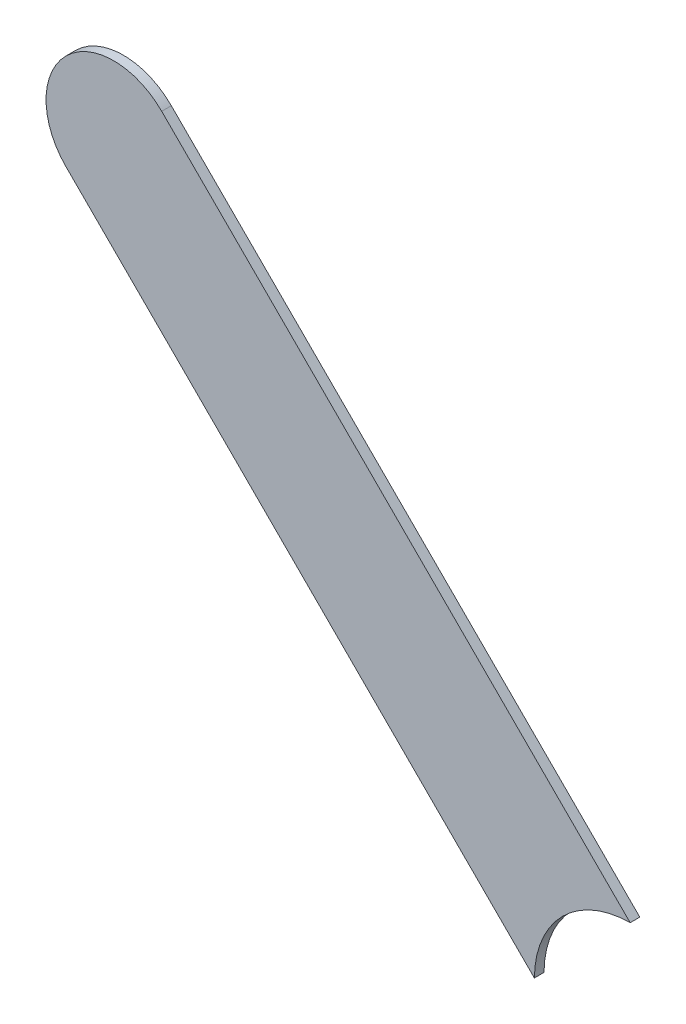
ISO-10303-21;
HEADER;
FILE_DESCRIPTION(('STEP AP214'),'2;1');
FILE_NAME('part.step','',(''),(''),'','','');
FILE_SCHEMA(('AUTOMOTIVE_DESIGN { 1 0 10303 214 1 1 1 1 }'));
ENDSEC;
DATA;
#1=APPLICATION_CONTEXT('core data for automotive mechanical design processes');
#2=APPLICATION_PROTOCOL_DEFINITION('international standard','automotive_design',2000,#1);
#3=PRODUCT_CONTEXT('',#1,'mechanical');
#4=PRODUCT('Part','Part','',(#3));
#5=PRODUCT_RELATED_PRODUCT_CATEGORY('part','',(#4));
#6=PRODUCT_DEFINITION_FORMATION('','',#4);
#7=PRODUCT_DEFINITION_CONTEXT('part definition',#1,'design');
#8=PRODUCT_DEFINITION('design','',#6,#7);
#9=PRODUCT_DEFINITION_SHAPE('','',#8);
#10=(LENGTH_UNIT() NAMED_UNIT(*) SI_UNIT(.MILLI.,.METRE.));
#11=(NAMED_UNIT(*) PLANE_ANGLE_UNIT() SI_UNIT($,.RADIAN.));
#12=(NAMED_UNIT(*) SI_UNIT($,.STERADIAN.) SOLID_ANGLE_UNIT());
#13=UNCERTAINTY_MEASURE_WITH_UNIT(LENGTH_MEASURE(1.E-05),#10,'distance_accuracy_value','');
#14=(GEOMETRIC_REPRESENTATION_CONTEXT(3) GLOBAL_UNCERTAINTY_ASSIGNED_CONTEXT((#13)) GLOBAL_UNIT_ASSIGNED_CONTEXT((#10,
#11,#12)) REPRESENTATION_CONTEXT('',''));
#15=CARTESIAN_POINT('',(0.,0.,0.));
#16=DIRECTION('',(0.,0.,1.));
#17=DIRECTION('',(1.,0.,0.));
#18=AXIS2_PLACEMENT_3D('',#15,#16,#17);
#19=CARTESIAN_POINT('',(54.81521422,109.23123442,0.));
#20=DIRECTION('',(0.707106781186549,0.707106781186546,0.));
#21=DIRECTION('',(0.707106781186546,-0.707106781186549,0.));
#22=AXIS2_PLACEMENT_3D('',#19,#20,#21);
#23=PLANE('',#22);
#24=DIRECTION('',(0.707106781186546,-0.707106781186549,0.));
#25=VECTOR('',#24,1.);
#26=CARTESIAN_POINT('',(54.81521422,109.23123442,0.03556));
#27=LINE('',#26,#25);
#28=CARTESIAN_POINT('',(54.81521422,109.23123442,0.03556));
#29=VERTEX_POINT('',#28);
#30=CARTESIAN_POINT('',(56.5444063594892,107.502042280511,0.03556));
#31=VERTEX_POINT('',#30);
#32=EDGE_CURVE('E11',#29,#31,#27,.T.);
#33=ORIENTED_EDGE('',*,*,#32,.F.);
#34=DIRECTION('',(0.,0.,1.));
#35=VECTOR('',#34,1.);
#36=CARTESIAN_POINT('',(54.81521422,109.23123442,0.));
#37=LINE('',#36,#35);
#38=CARTESIAN_POINT('',(54.81521422,109.23123442,0.));
#39=VERTEX_POINT('',#38);
#40=EDGE_CURVE('E24',#39,#29,#37,.T.);
#41=ORIENTED_EDGE('',*,*,#40,.F.);
#42=DIRECTION('',(0.707106781186546,-0.707106781186549,0.));
#43=VECTOR('',#42,1.);
#44=CARTESIAN_POINT('',(54.81521422,109.23123442,0.));
#45=LINE('',#44,#43);
#46=CARTESIAN_POINT('',(56.5444063594892,107.502042280511,0.));
#47=VERTEX_POINT('',#46);
#48=EDGE_CURVE('E75',#39,#47,#45,.T.);
#49=ORIENTED_EDGE('',*,*,#48,.T.);
#50=DIRECTION('',(0.,0.,1.));
#51=VECTOR('',#50,1.);
#52=CARTESIAN_POINT('',(56.5444063594892,107.502042280511,0.));
#53=LINE('',#52,#51);
#54=EDGE_CURVE('E37',#47,#31,#53,.T.);
#55=ORIENTED_EDGE('',*,*,#54,.T.);
#56=EDGE_LOOP('',(#33,#41,#49,#55));
#57=FACE_BOUND('',#56,.T.);
#58=ADVANCED_FACE('F17',(#57),#23,.F.);
#59=CARTESIAN_POINT('',(56.9000005,107.5000009,0.));
#60=DIRECTION('',(0.,0.,-1.));
#61=DIRECTION('',(1.,0.,0.));
#62=AXIS2_PLACEMENT_3D('',#59,#60,#61);
#63=CYLINDRICAL_SURFACE('',#62,0.3556);
#64=DIRECTION('',(0.,0.,1.));
#65=VECTOR('',#64,1.);
#66=CARTESIAN_POINT('',(56.8979591194892,107.855595040511,0.));
#67=LINE('',#66,#65);
#68=CARTESIAN_POINT('',(56.8979591194892,107.855595040511,0.));
#69=VERTEX_POINT('',#68);
#70=CARTESIAN_POINT('',(56.8979591194892,107.855595040511,0.03556));
#71=VERTEX_POINT('',#70);
#72=EDGE_CURVE('E67',#69,#71,#67,.T.);
#73=ORIENTED_EDGE('',*,*,#72,.T.);
#74=CARTESIAN_POINT('',(56.9000005,107.5000009,0.03556));
#75=DIRECTION('',(0.,0.,1.));
#76=DIRECTION('',(1.,0.,0.));
#77=AXIS2_PLACEMENT_3D('',#74,#75,#76);
#78=CIRCLE('',#77,0.3556);
#79=EDGE_CURVE('E82',#71,#31,#78,.T.);
#80=ORIENTED_EDGE('',*,*,#79,.T.);
#81=ORIENTED_EDGE('',*,*,#54,.F.);
#82=CARTESIAN_POINT('',(56.9000005,107.5000009,0.));
#83=DIRECTION('',(0.,0.,1.));
#84=DIRECTION('',(1.,0.,0.));
#85=AXIS2_PLACEMENT_3D('',#82,#83,#84);
#86=CIRCLE('',#85,0.3556);
#87=EDGE_CURVE('E80',#69,#47,#86,.T.);
#88=ORIENTED_EDGE('',*,*,#87,.F.);
#89=EDGE_LOOP('',(#73,#80,#81,#88));
#90=FACE_BOUND('',#89,.T.);
#91=ADVANCED_FACE('F88',(#90),#63,.F.);
#92=CARTESIAN_POINT('',(56.8979591194892,107.855595040511,0.));
#93=DIRECTION('',(-0.707106781186545,-0.70710678118655,0.));
#94=DIRECTION('',(-0.70710678118655,0.707106781186545,0.));
#95=AXIS2_PLACEMENT_3D('',#92,#93,#94);
#96=PLANE('',#95);
#97=DIRECTION('',(-0.70710678118655,0.707106781186545,0.));
#98=VECTOR('',#97,1.);
#99=CARTESIAN_POINT('',(57.07677688,107.67677728,0.03556));
#100=LINE('',#99,#98);
#101=CARTESIAN_POINT('',(55.16876698,109.58478718,0.03556));
#102=VERTEX_POINT('',#101);
#103=EDGE_CURVE('E71',#71,#102,#100,.T.);
#104=ORIENTED_EDGE('',*,*,#103,.F.);
#105=ORIENTED_EDGE('',*,*,#72,.F.);
#106=DIRECTION('',(-0.70710678118655,0.707106781186545,0.));
#107=VECTOR('',#106,1.);
#108=CARTESIAN_POINT('',(57.07677688,107.67677728,0.));
#109=LINE('',#108,#107);
#110=CARTESIAN_POINT('',(55.16876698,109.58478718,0.));
#111=VERTEX_POINT('',#110);
#112=EDGE_CURVE('E63',#69,#111,#109,.T.);
#113=ORIENTED_EDGE('',*,*,#112,.T.);
#114=DIRECTION('',(0.,0.,1.));
#115=VECTOR('',#114,1.);
#116=CARTESIAN_POINT('',(55.16876698,109.58478718,0.));
#117=LINE('',#116,#115);
#118=EDGE_CURVE('E53',#111,#102,#117,.T.);
#119=ORIENTED_EDGE('',*,*,#118,.T.);
#120=EDGE_LOOP('',(#104,#105,#113,#119));
#121=FACE_BOUND('',#120,.T.);
#122=ADVANCED_FACE('F66',(#121),#96,.F.);
#123=CARTESIAN_POINT('',(54.9919906,109.4080108,0.));
#124=DIRECTION('',(0.,0.,-1.));
#125=DIRECTION('',(0.707106781186562,0.707106781186533,0.));
#126=AXIS2_PLACEMENT_3D('',#123,#124,#125);
#127=CYLINDRICAL_SURFACE('',#126,0.249999554103215);
#128=CARTESIAN_POINT('',(54.9919906,109.4080108,0.03556));
#129=DIRECTION('',(0.,0.,1.));
#130=DIRECTION('',(0.707106781186562,0.707106781186533,0.));
#131=AXIS2_PLACEMENT_3D('',#128,#129,#130);
#132=CIRCLE('',#131,0.249999554103215);
#133=EDGE_CURVE('E59',#102,#29,#132,.T.);
#134=ORIENTED_EDGE('',*,*,#133,.F.);
#135=ORIENTED_EDGE('',*,*,#118,.F.);
#136=CARTESIAN_POINT('',(54.9919906,109.4080108,0.));
#137=DIRECTION('',(0.,0.,1.));
#138=DIRECTION('',(0.707106781186562,0.707106781186533,0.));
#139=AXIS2_PLACEMENT_3D('',#136,#137,#138);
#140=CIRCLE('',#139,0.249999554103215);
#141=EDGE_CURVE('E57',#111,#39,#140,.T.);
#142=ORIENTED_EDGE('',*,*,#141,.T.);
#143=ORIENTED_EDGE('',*,*,#40,.T.);
#144=EDGE_LOOP('',(#134,#135,#142,#143));
#145=FACE_BOUND('',#144,.T.);
#146=ADVANCED_FACE('F55',(#145),#127,.T.);
#147=CARTESIAN_POINT('',(54.81521422,109.23123442,0.));
#148=DIRECTION('',(0.,0.,-1.));
#149=DIRECTION('',(-1.,0.,0.));
#150=AXIS2_PLACEMENT_3D('',#147,#148,#149);
#151=PLANE('',#150);
#152=ORIENTED_EDGE('',*,*,#48,.F.);
#153=ORIENTED_EDGE('',*,*,#141,.F.);
#154=ORIENTED_EDGE('',*,*,#112,.F.);
#155=ORIENTED_EDGE('',*,*,#87,.T.);
#156=EDGE_LOOP('',(#152,#153,#154,#155));
#157=FACE_BOUND('',#156,.T.);
#158=ADVANCED_FACE('F74',(#157),#151,.T.);
#159=CARTESIAN_POINT('',(54.81521422,109.23123442,0.03556));
#160=DIRECTION('',(0.,0.,-1.));
#161=DIRECTION('',(-1.,0.,0.));
#162=AXIS2_PLACEMENT_3D('',#159,#160,#161);
#163=PLANE('',#162);
#164=ORIENTED_EDGE('',*,*,#133,.T.);
#165=ORIENTED_EDGE('',*,*,#32,.T.);
#166=ORIENTED_EDGE('',*,*,#79,.F.);
#167=ORIENTED_EDGE('',*,*,#103,.T.);
#168=EDGE_LOOP('',(#164,#165,#166,#167));
#169=FACE_BOUND('',#168,.T.);
#170=ADVANCED_FACE('F91',(#169),#163,.F.);
#171=CLOSED_SHELL('',(#58,#91,#122,#146,#158,#170));
#172=MANIFOLD_SOLID_BREP('B1',#171);
#173=ADVANCED_BREP_SHAPE_REPRESENTATION('',(#18,#172),#14);
#174=SHAPE_DEFINITION_REPRESENTATION(#9,#173);
ENDSEC;
END-ISO-10303-21;
